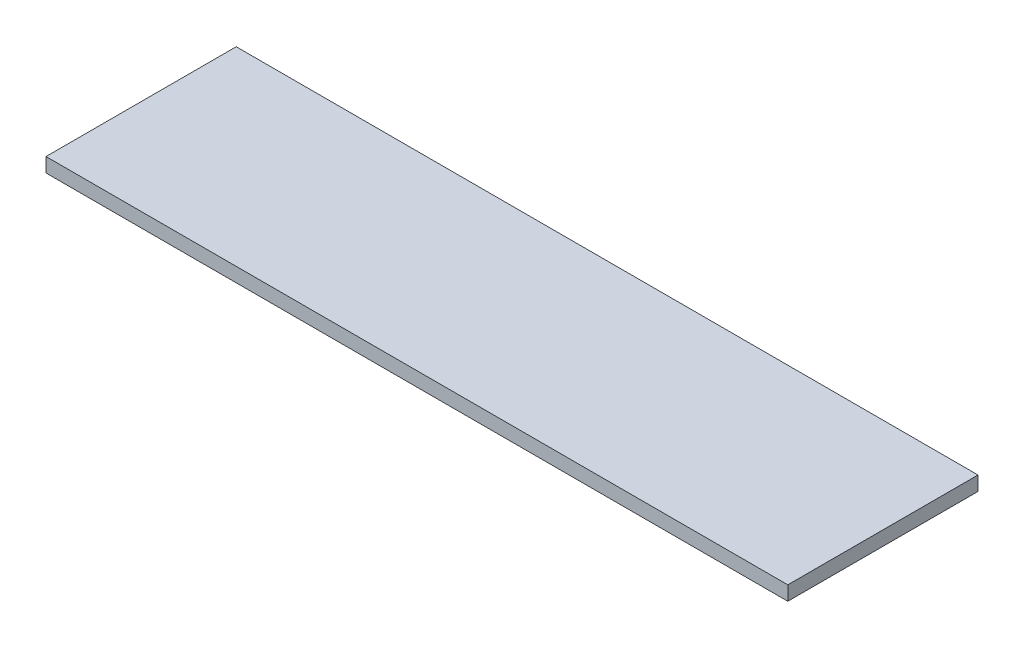
ISO-10303-21;
HEADER;
FILE_DESCRIPTION(('STEP AP214'),'2;1');
FILE_NAME('part.step','',(''),(''),'','','');
FILE_SCHEMA(('AUTOMOTIVE_DESIGN { 1 0 10303 214 1 1 1 1 }'));
ENDSEC;
DATA;
#1=APPLICATION_CONTEXT('core data for automotive mechanical design processes');
#2=APPLICATION_PROTOCOL_DEFINITION('international standard','automotive_design',2000,#1);
#3=PRODUCT_CONTEXT('',#1,'mechanical');
#4=PRODUCT('Part','Part','',(#3));
#5=PRODUCT_RELATED_PRODUCT_CATEGORY('part','',(#4));
#6=PRODUCT_DEFINITION_FORMATION('','',#4);
#7=PRODUCT_DEFINITION_CONTEXT('part definition',#1,'design');
#8=PRODUCT_DEFINITION('design','',#6,#7);
#9=PRODUCT_DEFINITION_SHAPE('','',#8);
#10=(LENGTH_UNIT() NAMED_UNIT(*) SI_UNIT(.MILLI.,.METRE.));
#11=(NAMED_UNIT(*) PLANE_ANGLE_UNIT() SI_UNIT($,.RADIAN.));
#12=(NAMED_UNIT(*) SI_UNIT($,.STERADIAN.) SOLID_ANGLE_UNIT());
#13=UNCERTAINTY_MEASURE_WITH_UNIT(LENGTH_MEASURE(1.E-05),#10,'distance_accuracy_value','');
#14=(GEOMETRIC_REPRESENTATION_CONTEXT(3) GLOBAL_UNCERTAINTY_ASSIGNED_CONTEXT((#13)) GLOBAL_UNIT_ASSIGNED_CONTEXT((#10,
#11,#12)) REPRESENTATION_CONTEXT('',''));
#15=CARTESIAN_POINT('',(0.,0.,0.));
#16=DIRECTION('',(0.,0.,1.));
#17=DIRECTION('',(1.,0.,0.));
#18=AXIS2_PLACEMENT_3D('',#15,#16,#17);
#19=CARTESIAN_POINT('',(0.,19.05,0.));
#20=DIRECTION('',(1.,0.,0.));
#21=DIRECTION('',(0.,0.,-1.));
#22=AXIS2_PLACEMENT_3D('',#19,#20,#21);
#23=PLANE('',#22);
#24=DIRECTION('',(0.,0.,1.));
#25=VECTOR('',#24,1.);
#26=CARTESIAN_POINT('',(0.,0.,0.));
#27=LINE('',#26,#25);
#28=CARTESIAN_POINT('',(0.,0.,0.));
#29=VERTEX_POINT('',#28);
#30=CARTESIAN_POINT('',(0.,0.,254.));
#31=VERTEX_POINT('',#30);
#32=EDGE_CURVE('E105',#29,#31,#27,.T.);
#33=ORIENTED_EDGE('',*,*,#32,.T.);
#34=DIRECTION('',(0.,-1.,0.));
#35=VECTOR('',#34,1.);
#36=CARTESIAN_POINT('',(0.,19.05,254.));
#37=LINE('',#36,#35);
#38=CARTESIAN_POINT('',(0.,19.05,254.));
#39=VERTEX_POINT('',#38);
#40=EDGE_CURVE('E11',#39,#31,#37,.T.);
#41=ORIENTED_EDGE('',*,*,#40,.F.);
#42=DIRECTION('',(0.,0.,1.));
#43=VECTOR('',#42,1.);
#44=CARTESIAN_POINT('',(0.,19.05,0.));
#45=LINE('',#44,#43);
#46=CARTESIAN_POINT('',(0.,19.05,0.));
#47=VERTEX_POINT('',#46);
#48=EDGE_CURVE('E89',#47,#39,#45,.T.);
#49=ORIENTED_EDGE('',*,*,#48,.F.);
#50=DIRECTION('',(0.,-1.,0.));
#51=VECTOR('',#50,1.);
#52=CARTESIAN_POINT('',(0.,19.05,0.));
#53=LINE('',#52,#51);
#54=EDGE_CURVE('E97',#47,#29,#53,.T.);
#55=ORIENTED_EDGE('',*,*,#54,.T.);
#56=EDGE_LOOP('',(#33,#41,#49,#55));
#57=FACE_BOUND('',#56,.T.);
#58=ADVANCED_FACE('F39',(#57),#23,.F.);
#59=CARTESIAN_POINT('',(0.,19.05,254.));
#60=DIRECTION('',(0.,0.,-1.));
#61=DIRECTION('',(-1.,0.,0.));
#62=AXIS2_PLACEMENT_3D('',#59,#60,#61);
#63=PLANE('',#62);
#64=DIRECTION('',(1.,0.,0.));
#65=VECTOR('',#64,1.);
#66=CARTESIAN_POINT('',(0.,0.,254.));
#67=LINE('',#66,#65);
#68=CARTESIAN_POINT('',(990.6,0.,254.));
#69=VERTEX_POINT('',#68);
#70=EDGE_CURVE('E92',#31,#69,#67,.T.);
#71=ORIENTED_EDGE('',*,*,#70,.T.);
#72=DIRECTION('',(0.,-1.,0.));
#73=VECTOR('',#72,1.);
#74=CARTESIAN_POINT('',(990.6,19.05,254.));
#75=LINE('',#74,#73);
#76=CARTESIAN_POINT('',(990.6,19.05,254.));
#77=VERTEX_POINT('',#76);
#78=EDGE_CURVE('E50',#77,#69,#75,.T.);
#79=ORIENTED_EDGE('',*,*,#78,.F.);
#80=DIRECTION('',(1.,0.,0.));
#81=VECTOR('',#80,1.);
#82=CARTESIAN_POINT('',(0.,19.05,254.));
#83=LINE('',#82,#81);
#84=EDGE_CURVE('E82',#39,#77,#83,.T.);
#85=ORIENTED_EDGE('',*,*,#84,.F.);
#86=ORIENTED_EDGE('',*,*,#40,.T.);
#87=EDGE_LOOP('',(#71,#79,#85,#86));
#88=FACE_BOUND('',#87,.T.);
#89=ADVANCED_FACE('F93',(#88),#63,.F.);
#90=CARTESIAN_POINT('',(990.6,19.05,0.));
#91=DIRECTION('',(-1.,0.,0.));
#92=DIRECTION('',(0.,0.,1.));
#93=AXIS2_PLACEMENT_3D('',#90,#91,#92);
#94=PLANE('',#93);
#95=DIRECTION('',(0.,0.,-1.));
#96=VECTOR('',#95,1.);
#97=CARTESIAN_POINT('',(990.6,0.,0.));
#98=LINE('',#97,#96);
#99=CARTESIAN_POINT('',(990.6,0.,0.));
#100=VERTEX_POINT('',#99);
#101=EDGE_CURVE('E72',#69,#100,#98,.T.);
#102=ORIENTED_EDGE('',*,*,#101,.T.);
#103=DIRECTION('',(0.,-1.,0.));
#104=VECTOR('',#103,1.);
#105=CARTESIAN_POINT('',(990.6,19.05,0.));
#106=LINE('',#105,#104);
#107=CARTESIAN_POINT('',(990.6,19.05,0.));
#108=VERTEX_POINT('',#107);
#109=EDGE_CURVE('E94',#108,#100,#106,.T.);
#110=ORIENTED_EDGE('',*,*,#109,.F.);
#111=DIRECTION('',(0.,0.,-1.));
#112=VECTOR('',#111,1.);
#113=CARTESIAN_POINT('',(990.6,19.05,0.));
#114=LINE('',#113,#112);
#115=EDGE_CURVE('E88',#77,#108,#114,.T.);
#116=ORIENTED_EDGE('',*,*,#115,.F.);
#117=ORIENTED_EDGE('',*,*,#78,.T.);
#118=EDGE_LOOP('',(#102,#110,#116,#117));
#119=FACE_BOUND('',#118,.T.);
#120=ADVANCED_FACE('F96',(#119),#94,.F.);
#121=CARTESIAN_POINT('',(0.,19.05,0.));
#122=DIRECTION('',(0.,0.,1.));
#123=DIRECTION('',(1.,0.,0.));
#124=AXIS2_PLACEMENT_3D('',#121,#122,#123);
#125=PLANE('',#124);
#126=DIRECTION('',(-1.,0.,0.));
#127=VECTOR('',#126,1.);
#128=CARTESIAN_POINT('',(0.,0.,0.));
#129=LINE('',#128,#127);
#130=EDGE_CURVE('E76',#100,#29,#129,.T.);
#131=ORIENTED_EDGE('',*,*,#130,.T.);
#132=ORIENTED_EDGE('',*,*,#54,.F.);
#133=DIRECTION('',(-1.,0.,0.));
#134=VECTOR('',#133,1.);
#135=CARTESIAN_POINT('',(0.,19.05,0.));
#136=LINE('',#135,#134);
#137=EDGE_CURVE('E54',#108,#47,#136,.T.);
#138=ORIENTED_EDGE('',*,*,#137,.F.);
#139=ORIENTED_EDGE('',*,*,#109,.T.);
#140=EDGE_LOOP('',(#131,#132,#138,#139));
#141=FACE_BOUND('',#140,.T.);
#142=ADVANCED_FACE('F108',(#141),#125,.F.);
#143=CARTESIAN_POINT('',(0.,19.05,0.));
#144=DIRECTION('',(0.,1.,0.));
#145=DIRECTION('',(0.,0.,1.));
#146=AXIS2_PLACEMENT_3D('',#143,#144,#145);
#147=PLANE('',#146);
#148=ORIENTED_EDGE('',*,*,#48,.T.);
#149=ORIENTED_EDGE('',*,*,#84,.T.);
#150=ORIENTED_EDGE('',*,*,#115,.T.);
#151=ORIENTED_EDGE('',*,*,#137,.T.);
#152=EDGE_LOOP('',(#148,#149,#150,#151));
#153=FACE_BOUND('',#152,.T.);
#154=ADVANCED_FACE('F86',(#153),#147,.T.);
#155=CARTESIAN_POINT('',(0.,0.,0.));
#156=DIRECTION('',(0.,1.,0.));
#157=DIRECTION('',(0.,0.,1.));
#158=AXIS2_PLACEMENT_3D('',#155,#156,#157);
#159=PLANE('',#158);
#160=ORIENTED_EDGE('',*,*,#32,.F.);
#161=ORIENTED_EDGE('',*,*,#130,.F.);
#162=ORIENTED_EDGE('',*,*,#101,.F.);
#163=ORIENTED_EDGE('',*,*,#70,.F.);
#164=EDGE_LOOP('',(#160,#161,#162,#163));
#165=FACE_BOUND('',#164,.T.);
#166=ADVANCED_FACE('F115',(#165),#159,.F.);
#167=CLOSED_SHELL('',(#58,#89,#120,#142,#154,#166));
#168=MANIFOLD_SOLID_BREP('B2',#167);
#169=ADVANCED_BREP_SHAPE_REPRESENTATION('',(#18,#168),#14);
#170=SHAPE_DEFINITION_REPRESENTATION(#9,#169);
ENDSEC;
END-ISO-10303-21;
